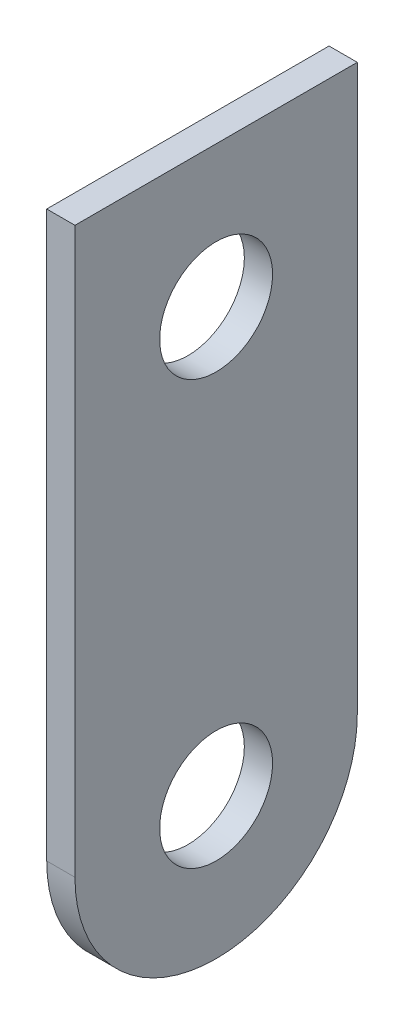
ISO-10303-21;
HEADER;
FILE_DESCRIPTION(('STEP AP214'),'2;1');
FILE_NAME('part.step','',(''),(''),'','','');
FILE_SCHEMA(('AUTOMOTIVE_DESIGN { 1 0 10303 214 1 1 1 1 }'));
ENDSEC;
DATA;
#1=APPLICATION_CONTEXT('core data for automotive mechanical design processes');
#2=APPLICATION_PROTOCOL_DEFINITION('international standard','automotive_design',2000,#1);
#3=PRODUCT_CONTEXT('',#1,'mechanical');
#4=PRODUCT('Part','Part','',(#3));
#5=PRODUCT_RELATED_PRODUCT_CATEGORY('part','',(#4));
#6=PRODUCT_DEFINITION_FORMATION('','',#4);
#7=PRODUCT_DEFINITION_CONTEXT('part definition',#1,'design');
#8=PRODUCT_DEFINITION('design','',#6,#7);
#9=PRODUCT_DEFINITION_SHAPE('','',#8);
#10=(LENGTH_UNIT() NAMED_UNIT(*) SI_UNIT(.MILLI.,.METRE.));
#11=(NAMED_UNIT(*) PLANE_ANGLE_UNIT() SI_UNIT($,.RADIAN.));
#12=(NAMED_UNIT(*) SI_UNIT($,.STERADIAN.) SOLID_ANGLE_UNIT());
#13=UNCERTAINTY_MEASURE_WITH_UNIT(LENGTH_MEASURE(1.E-05),#10,'distance_accuracy_value','');
#14=(GEOMETRIC_REPRESENTATION_CONTEXT(3) GLOBAL_UNCERTAINTY_ASSIGNED_CONTEXT((#13)) GLOBAL_UNIT_ASSIGNED_CONTEXT((#10,
#11,#12)) REPRESENTATION_CONTEXT('',''));
#15=CARTESIAN_POINT('',(0.,0.,0.));
#16=DIRECTION('',(0.,0.,1.));
#17=DIRECTION('',(1.,0.,0.));
#18=AXIS2_PLACEMENT_3D('',#15,#16,#17);
#19=CARTESIAN_POINT('',(5.,50.,-25.));
#20=DIRECTION('',(1.,0.,0.));
#21=DIRECTION('',(0.,0.,-1.));
#22=AXIS2_PLACEMENT_3D('',#19,#20,#21);
#23=PLANE('',#22);
#24=CARTESIAN_POINT('',(5.,50.,-25.));
#25=DIRECTION('',(1.,0.,0.));
#26=DIRECTION('',(0.,0.,-1.));
#27=AXIS2_PLACEMENT_3D('',#24,#25,#26);
#28=CIRCLE('',#27,10.);
#29=CARTESIAN_POINT('',(5.,50.,-35.));
#30=VERTEX_POINT('',#29);
#31=EDGE_CURVE('E105',#30,#30,#28,.T.);
#32=ORIENTED_EDGE('',*,*,#31,.F.);
#33=EDGE_LOOP('',(#32));
#34=FACE_BOUND('',#33,.T.);
#35=DIRECTION('',(0.,1.,0.));
#36=VECTOR('',#35,1.);
#37=CARTESIAN_POINT('',(5.,50.,-50.));
#38=LINE('',#37,#36);
#39=CARTESIAN_POINT('',(5.,50.,-50.));
#40=VERTEX_POINT('',#39);
#41=CARTESIAN_POINT('',(5.,150.,-50.));
#42=VERTEX_POINT('',#41);
#43=EDGE_CURVE('E90',#40,#42,#38,.T.);
#44=ORIENTED_EDGE('',*,*,#43,.T.);
#45=DIRECTION('',(0.,0.,1.));
#46=VECTOR('',#45,1.);
#47=CARTESIAN_POINT('',(5.,150.,-50.));
#48=LINE('',#47,#46);
#49=CARTESIAN_POINT('',(5.,150.,0.));
#50=VERTEX_POINT('',#49);
#51=EDGE_CURVE('E85',#42,#50,#48,.T.);
#52=ORIENTED_EDGE('',*,*,#51,.T.);
#53=DIRECTION('',(0.,-1.,0.));
#54=VECTOR('',#53,1.);
#55=CARTESIAN_POINT('',(5.,50.,0.));
#56=LINE('',#55,#54);
#57=CARTESIAN_POINT('',(5.,50.,0.));
#58=VERTEX_POINT('',#57);
#59=EDGE_CURVE('E88',#50,#58,#56,.T.);
#60=ORIENTED_EDGE('',*,*,#59,.T.);
#61=CARTESIAN_POINT('',(5.,50.,-25.));
#62=DIRECTION('',(1.,0.,0.));
#63=DIRECTION('',(0.,0.,-1.));
#64=AXIS2_PLACEMENT_3D('',#61,#62,#63);
#65=CIRCLE('',#64,25.);
#66=EDGE_CURVE('E55',#58,#40,#65,.T.);
#67=ORIENTED_EDGE('',*,*,#66,.T.);
#68=EDGE_LOOP('',(#44,#52,#60,#67));
#69=FACE_BOUND('',#68,.T.);
#70=CARTESIAN_POINT('',(5.,125.,-25.));
#71=DIRECTION('',(1.,0.,0.));
#72=DIRECTION('',(0.,0.,-1.));
#73=AXIS2_PLACEMENT_3D('',#70,#71,#72);
#74=CIRCLE('',#73,10.);
#75=CARTESIAN_POINT('',(5.,125.,-35.));
#76=VERTEX_POINT('',#75);
#77=EDGE_CURVE('E120',#76,#76,#74,.T.);
#78=ORIENTED_EDGE('',*,*,#77,.F.);
#79=EDGE_LOOP('',(#78));
#80=FACE_BOUND('',#79,.T.);
#81=ADVANCED_FACE('F38',(#34,#69,#80),#23,.T.);
#82=CARTESIAN_POINT('',(0.,50.,-25.));
#83=DIRECTION('',(1.,0.,0.));
#84=DIRECTION('',(0.,0.,-1.));
#85=AXIS2_PLACEMENT_3D('',#82,#83,#84);
#86=PLANE('',#85);
#87=DIRECTION('',(0.,1.,0.));
#88=VECTOR('',#87,1.);
#89=CARTESIAN_POINT('',(0.,50.,-50.));
#90=LINE('',#89,#88);
#91=CARTESIAN_POINT('',(0.,50.,-50.));
#92=VERTEX_POINT('',#91);
#93=CARTESIAN_POINT('',(0.,150.,-50.));
#94=VERTEX_POINT('',#93);
#95=EDGE_CURVE('E102',#92,#94,#90,.T.);
#96=ORIENTED_EDGE('',*,*,#95,.F.);
#97=CARTESIAN_POINT('',(0.,50.,-25.));
#98=DIRECTION('',(1.,0.,0.));
#99=DIRECTION('',(0.,0.,-1.));
#100=AXIS2_PLACEMENT_3D('',#97,#98,#99);
#101=CIRCLE('',#100,25.);
#102=CARTESIAN_POINT('',(0.,50.,0.));
#103=VERTEX_POINT('',#102);
#104=EDGE_CURVE('E78',#103,#92,#101,.T.);
#105=ORIENTED_EDGE('',*,*,#104,.F.);
#106=DIRECTION('',(0.,-1.,0.));
#107=VECTOR('',#106,1.);
#108=CARTESIAN_POINT('',(0.,50.,0.));
#109=LINE('',#108,#107);
#110=CARTESIAN_POINT('',(0.,150.,0.));
#111=VERTEX_POINT('',#110);
#112=EDGE_CURVE('E72',#111,#103,#109,.T.);
#113=ORIENTED_EDGE('',*,*,#112,.F.);
#114=DIRECTION('',(0.,0.,1.));
#115=VECTOR('',#114,1.);
#116=CARTESIAN_POINT('',(0.,150.,-50.));
#117=LINE('',#116,#115);
#118=EDGE_CURVE('E94',#94,#111,#117,.T.);
#119=ORIENTED_EDGE('',*,*,#118,.F.);
#120=EDGE_LOOP('',(#96,#105,#113,#119));
#121=FACE_BOUND('',#120,.T.);
#122=CARTESIAN_POINT('',(0.,50.,-25.));
#123=DIRECTION('',(1.,0.,0.));
#124=DIRECTION('',(0.,0.,-1.));
#125=AXIS2_PLACEMENT_3D('',#122,#123,#124);
#126=CIRCLE('',#125,10.);
#127=CARTESIAN_POINT('',(0.,50.,-35.));
#128=VERTEX_POINT('',#127);
#129=EDGE_CURVE('E117',#128,#128,#126,.T.);
#130=ORIENTED_EDGE('',*,*,#129,.T.);
#131=EDGE_LOOP('',(#130));
#132=FACE_BOUND('',#131,.T.);
#133=CARTESIAN_POINT('',(0.,125.,-25.));
#134=DIRECTION('',(1.,0.,0.));
#135=DIRECTION('',(0.,0.,-1.));
#136=AXIS2_PLACEMENT_3D('',#133,#134,#135);
#137=CIRCLE('',#136,10.);
#138=CARTESIAN_POINT('',(0.,125.,-35.));
#139=VERTEX_POINT('',#138);
#140=EDGE_CURVE('E123',#139,#139,#137,.T.);
#141=ORIENTED_EDGE('',*,*,#140,.T.);
#142=EDGE_LOOP('',(#141));
#143=FACE_BOUND('',#142,.T.);
#144=ADVANCED_FACE('F113',(#121,#132,#143),#86,.F.);
#145=CARTESIAN_POINT('',(5.,50.,-50.));
#146=DIRECTION('',(0.,0.,1.));
#147=DIRECTION('',(1.,0.,0.));
#148=AXIS2_PLACEMENT_3D('',#145,#146,#147);
#149=PLANE('',#148);
#150=ORIENTED_EDGE('',*,*,#95,.T.);
#151=DIRECTION('',(-1.,0.,0.));
#152=VECTOR('',#151,1.);
#153=CARTESIAN_POINT('',(5.,150.,-50.));
#154=LINE('',#153,#152);
#155=EDGE_CURVE('E11',#42,#94,#154,.T.);
#156=ORIENTED_EDGE('',*,*,#155,.F.);
#157=ORIENTED_EDGE('',*,*,#43,.F.);
#158=DIRECTION('',(-1.,0.,0.));
#159=VECTOR('',#158,1.);
#160=CARTESIAN_POINT('',(5.,50.,-50.));
#161=LINE('',#160,#159);
#162=EDGE_CURVE('E98',#40,#92,#161,.T.);
#163=ORIENTED_EDGE('',*,*,#162,.T.);
#164=EDGE_LOOP('',(#150,#156,#157,#163));
#165=FACE_BOUND('',#164,.T.);
#166=ADVANCED_FACE('F40',(#165),#149,.F.);
#167=CARTESIAN_POINT('',(5.,150.,-50.));
#168=DIRECTION('',(0.,-1.,0.));
#169=DIRECTION('',(0.,0.,-1.));
#170=AXIS2_PLACEMENT_3D('',#167,#168,#169);
#171=PLANE('',#170);
#172=ORIENTED_EDGE('',*,*,#118,.T.);
#173=DIRECTION('',(-1.,0.,0.));
#174=VECTOR('',#173,1.);
#175=CARTESIAN_POINT('',(5.,150.,0.));
#176=LINE('',#175,#174);
#177=EDGE_CURVE('E47',#50,#111,#176,.T.);
#178=ORIENTED_EDGE('',*,*,#177,.F.);
#179=ORIENTED_EDGE('',*,*,#51,.F.);
#180=ORIENTED_EDGE('',*,*,#155,.T.);
#181=EDGE_LOOP('',(#172,#178,#179,#180));
#182=FACE_BOUND('',#181,.T.);
#183=ADVANCED_FACE('F93',(#182),#171,.F.);
#184=CARTESIAN_POINT('',(5.,50.,0.));
#185=DIRECTION('',(0.,0.,-1.));
#186=DIRECTION('',(-1.,0.,0.));
#187=AXIS2_PLACEMENT_3D('',#184,#185,#186);
#188=PLANE('',#187);
#189=ORIENTED_EDGE('',*,*,#112,.T.);
#190=DIRECTION('',(-1.,0.,0.));
#191=VECTOR('',#190,1.);
#192=CARTESIAN_POINT('',(5.,50.,0.));
#193=LINE('',#192,#191);
#194=EDGE_CURVE('E95',#58,#103,#193,.T.);
#195=ORIENTED_EDGE('',*,*,#194,.F.);
#196=ORIENTED_EDGE('',*,*,#59,.F.);
#197=ORIENTED_EDGE('',*,*,#177,.T.);
#198=EDGE_LOOP('',(#189,#195,#196,#197));
#199=FACE_BOUND('',#198,.T.);
#200=ADVANCED_FACE('F96',(#199),#188,.F.);
#201=CARTESIAN_POINT('',(5.,50.,-25.));
#202=DIRECTION('',(-1.,0.,0.));
#203=DIRECTION('',(0.,0.,1.));
#204=AXIS2_PLACEMENT_3D('',#201,#202,#203);
#205=CYLINDRICAL_SURFACE('',#204,25.);
#206=ORIENTED_EDGE('',*,*,#104,.T.);
#207=ORIENTED_EDGE('',*,*,#162,.F.);
#208=ORIENTED_EDGE('',*,*,#66,.F.);
#209=ORIENTED_EDGE('',*,*,#194,.T.);
#210=EDGE_LOOP('',(#206,#207,#208,#209));
#211=FACE_BOUND('',#210,.T.);
#212=ADVANCED_FACE('F110',(#211),#205,.T.);
#213=CARTESIAN_POINT('',(5.,50.,-25.));
#214=DIRECTION('',(-1.,0.,0.));
#215=DIRECTION('',(0.,0.,1.));
#216=AXIS2_PLACEMENT_3D('',#213,#214,#215);
#217=CYLINDRICAL_SURFACE('',#216,10.);
#218=ORIENTED_EDGE('',*,*,#31,.T.);
#219=EDGE_LOOP('',(#218));
#220=FACE_BOUND('',#219,.T.);
#221=ORIENTED_EDGE('',*,*,#129,.F.);
#222=EDGE_LOOP('',(#221));
#223=FACE_BOUND('',#222,.T.);
#224=ADVANCED_FACE('F140',(#220,#223),#217,.F.);
#225=CARTESIAN_POINT('',(5.,125.,-25.));
#226=DIRECTION('',(-1.,0.,0.));
#227=DIRECTION('',(0.,0.,1.));
#228=AXIS2_PLACEMENT_3D('',#225,#226,#227);
#229=CYLINDRICAL_SURFACE('',#228,10.);
#230=ORIENTED_EDGE('',*,*,#77,.T.);
#231=EDGE_LOOP('',(#230));
#232=FACE_BOUND('',#231,.T.);
#233=ORIENTED_EDGE('',*,*,#140,.F.);
#234=EDGE_LOOP('',(#233));
#235=FACE_BOUND('',#234,.T.);
#236=ADVANCED_FACE('F129',(#232,#235),#229,.F.);
#237=CLOSED_SHELL('',(#81,#144,#166,#183,#200,#212,#224,#236));
#238=MANIFOLD_SOLID_BREP('B2',#237);
#239=ADVANCED_BREP_SHAPE_REPRESENTATION('',(#18,#238),#14);
#240=SHAPE_DEFINITION_REPRESENTATION(#9,#239);
ENDSEC;
END-ISO-10303-21;
